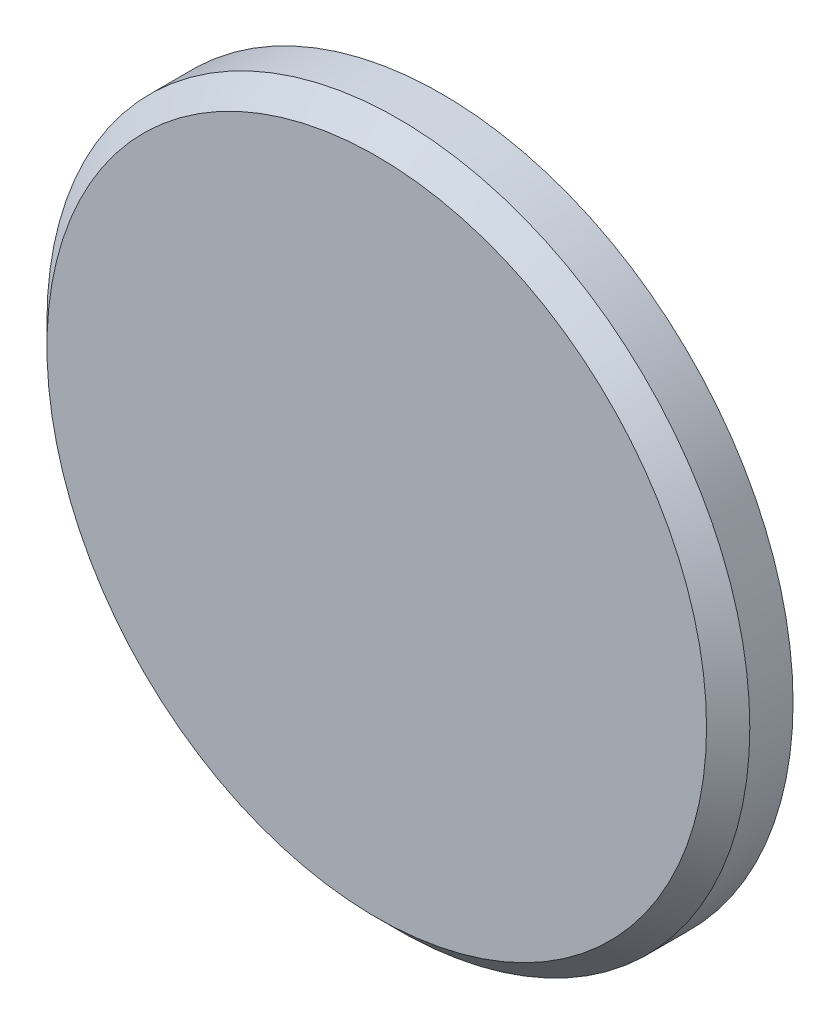
ISO-10303-21;
HEADER;
FILE_DESCRIPTION(('STEP AP214'),'2;1');
FILE_NAME('part.step','',(''),(''),'','','');
FILE_SCHEMA(('AUTOMOTIVE_DESIGN { 1 0 10303 214 1 1 1 1 }'));
ENDSEC;
DATA;
#1=APPLICATION_CONTEXT('core data for automotive mechanical design processes');
#2=APPLICATION_PROTOCOL_DEFINITION('international standard','automotive_design',2000,#1);
#3=PRODUCT_CONTEXT('',#1,'mechanical');
#4=PRODUCT('Part','Part','',(#3));
#5=PRODUCT_RELATED_PRODUCT_CATEGORY('part','',(#4));
#6=PRODUCT_DEFINITION_FORMATION('','',#4);
#7=PRODUCT_DEFINITION_CONTEXT('part definition',#1,'design');
#8=PRODUCT_DEFINITION('design','',#6,#7);
#9=PRODUCT_DEFINITION_SHAPE('','',#8);
#10=(LENGTH_UNIT() NAMED_UNIT(*) SI_UNIT(.MILLI.,.METRE.));
#11=(NAMED_UNIT(*) PLANE_ANGLE_UNIT() SI_UNIT($,.RADIAN.));
#12=(NAMED_UNIT(*) SI_UNIT($,.STERADIAN.) SOLID_ANGLE_UNIT());
#13=UNCERTAINTY_MEASURE_WITH_UNIT(LENGTH_MEASURE(1.E-05),#10,'distance_accuracy_value','');
#14=(GEOMETRIC_REPRESENTATION_CONTEXT(3) GLOBAL_UNCERTAINTY_ASSIGNED_CONTEXT((#13)) GLOBAL_UNIT_ASSIGNED_CONTEXT((#10,
#11,#12)) REPRESENTATION_CONTEXT('',''));
#15=CARTESIAN_POINT('',(0.,0.,0.));
#16=DIRECTION('',(0.,0.,1.));
#17=DIRECTION('',(1.,0.,0.));
#18=AXIS2_PLACEMENT_3D('',#15,#16,#17);
#19=CARTESIAN_POINT('',(0.,0.,3.));
#20=DIRECTION('',(0.,0.,-1.));
#21=DIRECTION('',(-1.,0.,0.));
#22=AXIS2_PLACEMENT_3D('',#19,#20,#21);
#23=CYLINDRICAL_SURFACE('',#22,16.25);
#24=CARTESIAN_POINT('',(0.,0.,1.99999999999999));
#25=DIRECTION('',(0.,0.,1.));
#26=DIRECTION('',(1.,0.,0.));
#27=AXIS2_PLACEMENT_3D('',#24,#25,#26);
#28=CIRCLE('',#27,16.25);
#29=CARTESIAN_POINT('',(16.25,0.,1.99999999999999));
#30=VERTEX_POINT('',#29);
#31=EDGE_CURVE('E10',#30,#30,#28,.F.);
#32=ORIENTED_EDGE('',*,*,#31,.T.);
#33=EDGE_LOOP('',(#32));
#34=FACE_BOUND('',#33,.T.);
#35=CARTESIAN_POINT('',(0.,0.,0.));
#36=DIRECTION('',(0.,0.,1.));
#37=DIRECTION('',(1.,0.,0.));
#38=AXIS2_PLACEMENT_3D('',#35,#36,#37);
#39=CIRCLE('',#38,16.25);
#40=CARTESIAN_POINT('',(16.25,0.,0.));
#41=VERTEX_POINT('',#40);
#42=EDGE_CURVE('E40',#41,#41,#39,.T.);
#43=ORIENTED_EDGE('',*,*,#42,.T.);
#44=EDGE_LOOP('',(#43));
#45=FACE_BOUND('',#44,.T.);
#46=ADVANCED_FACE('F30',(#34,#45),#23,.T.);
#47=CARTESIAN_POINT('',(0.,0.,3.));
#48=DIRECTION('',(0.,0.,1.));
#49=DIRECTION('',(1.,0.,0.));
#50=AXIS2_PLACEMENT_3D('',#47,#48,#49);
#51=PLANE('',#50);
#52=CARTESIAN_POINT('',(0.,0.,3.));
#53=DIRECTION('',(0.,0.,1.));
#54=DIRECTION('',(1.,0.,0.));
#55=AXIS2_PLACEMENT_3D('',#52,#53,#54);
#56=CIRCLE('',#55,15.25);
#57=CARTESIAN_POINT('',(15.25,0.,3.));
#58=VERTEX_POINT('',#57);
#59=EDGE_CURVE('E36',#58,#58,#56,.T.);
#60=ORIENTED_EDGE('',*,*,#59,.T.);
#61=EDGE_LOOP('',(#60));
#62=FACE_BOUND('',#61,.T.);
#63=ADVANCED_FACE('F51',(#62),#51,.T.);
#64=CARTESIAN_POINT('',(0.,0.,0.));
#65=DIRECTION('',(0.,0.,1.));
#66=DIRECTION('',(1.,0.,0.));
#67=AXIS2_PLACEMENT_3D('',#64,#65,#66);
#68=PLANE('',#67);
#69=ORIENTED_EDGE('',*,*,#42,.F.);
#70=EDGE_LOOP('',(#69));
#71=FACE_BOUND('',#70,.T.);
#72=ADVANCED_FACE('F48',(#71),#68,.F.);
#73=CARTESIAN_POINT('',(0.,0.,3.));
#74=DIRECTION('',(0.,0.,-1.));
#75=DIRECTION('',(-1.,0.,0.));
#76=AXIS2_PLACEMENT_3D('',#73,#74,#75);
#77=CONICAL_SURFACE('',#76,15.25,0.785398163397454);
#78=ORIENTED_EDGE('',*,*,#31,.F.);
#79=EDGE_LOOP('',(#78));
#80=FACE_BOUND('',#79,.T.);
#81=ORIENTED_EDGE('',*,*,#59,.F.);
#82=EDGE_LOOP('',(#81));
#83=FACE_BOUND('',#82,.T.);
#84=ADVANCED_FACE('F50',(#80,#83),#77,.T.);
#85=CLOSED_SHELL('',(#46,#63,#72,#84));
#86=MANIFOLD_SOLID_BREP('B2',#85);
#87=ADVANCED_BREP_SHAPE_REPRESENTATION('',(#18,#86),#14);
#88=SHAPE_DEFINITION_REPRESENTATION(#9,#87);
ENDSEC;
END-ISO-10303-21;
